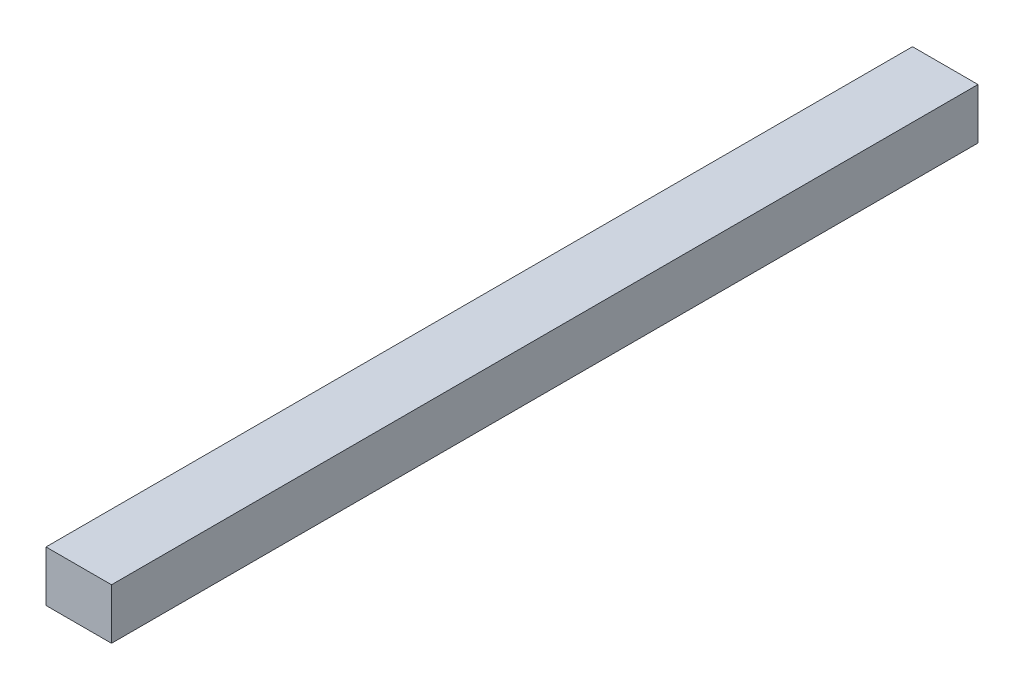
ISO-10303-21;
HEADER;
FILE_DESCRIPTION(('STEP AP214'),'2;1');
FILE_NAME('part.step','',(''),(''),'','','');
FILE_SCHEMA(('AUTOMOTIVE_DESIGN { 1 0 10303 214 1 1 1 1 }'));
ENDSEC;
DATA;
#1=APPLICATION_CONTEXT('core data for automotive mechanical design processes');
#2=APPLICATION_PROTOCOL_DEFINITION('international standard','automotive_design',2000,#1);
#3=PRODUCT_CONTEXT('',#1,'mechanical');
#4=PRODUCT('Part','Part','',(#3));
#5=PRODUCT_RELATED_PRODUCT_CATEGORY('part','',(#4));
#6=PRODUCT_DEFINITION_FORMATION('','',#4);
#7=PRODUCT_DEFINITION_CONTEXT('part definition',#1,'design');
#8=PRODUCT_DEFINITION('design','',#6,#7);
#9=PRODUCT_DEFINITION_SHAPE('','',#8);
#10=(LENGTH_UNIT() NAMED_UNIT(*) SI_UNIT(.MILLI.,.METRE.));
#11=(NAMED_UNIT(*) PLANE_ANGLE_UNIT() SI_UNIT($,.RADIAN.));
#12=(NAMED_UNIT(*) SI_UNIT($,.STERADIAN.) SOLID_ANGLE_UNIT());
#13=UNCERTAINTY_MEASURE_WITH_UNIT(LENGTH_MEASURE(1.E-05),#10,'distance_accuracy_value','');
#14=(GEOMETRIC_REPRESENTATION_CONTEXT(3) GLOBAL_UNCERTAINTY_ASSIGNED_CONTEXT((#13)) GLOBAL_UNIT_ASSIGNED_CONTEXT((#10,
#11,#12)) REPRESENTATION_CONTEXT('',''));
#15=CARTESIAN_POINT('',(0.,0.,0.));
#16=DIRECTION('',(0.,0.,1.));
#17=DIRECTION('',(1.,0.,0.));
#18=AXIS2_PLACEMENT_3D('',#15,#16,#17);
#19=CARTESIAN_POINT('',(1.55,-1.2,41.));
#20=DIRECTION('',(-1.,0.,0.));
#21=DIRECTION('',(0.,0.,1.));
#22=AXIS2_PLACEMENT_3D('',#19,#20,#21);
#23=PLANE('',#22);
#24=DIRECTION('',(0.,1.,0.));
#25=VECTOR('',#24,1.);
#26=CARTESIAN_POINT('',(1.55,-1.2,0.));
#27=LINE('',#26,#25);
#28=CARTESIAN_POINT('',(1.55,-1.2,0.));
#29=VERTEX_POINT('',#28);
#30=CARTESIAN_POINT('',(1.55,1.2,0.));
#31=VERTEX_POINT('',#30);
#32=EDGE_CURVE('E96',#29,#31,#27,.T.);
#33=ORIENTED_EDGE('',*,*,#32,.T.);
#34=DIRECTION('',(0.,0.,-1.));
#35=VECTOR('',#34,1.);
#36=CARTESIAN_POINT('',(1.55,1.2,41.));
#37=LINE('',#36,#35);
#38=CARTESIAN_POINT('',(1.55,1.2,41.));
#39=VERTEX_POINT('',#38);
#40=EDGE_CURVE('E11',#39,#31,#37,.T.);
#41=ORIENTED_EDGE('',*,*,#40,.F.);
#42=DIRECTION('',(0.,1.,0.));
#43=VECTOR('',#42,1.);
#44=CARTESIAN_POINT('',(1.55,-1.2,41.));
#45=LINE('',#44,#43);
#46=CARTESIAN_POINT('',(1.55,-1.2,41.));
#47=VERTEX_POINT('',#46);
#48=EDGE_CURVE('E84',#47,#39,#45,.T.);
#49=ORIENTED_EDGE('',*,*,#48,.F.);
#50=DIRECTION('',(0.,0.,-1.));
#51=VECTOR('',#50,1.);
#52=CARTESIAN_POINT('',(1.55,-1.2,41.));
#53=LINE('',#52,#51);
#54=EDGE_CURVE('E92',#47,#29,#53,.T.);
#55=ORIENTED_EDGE('',*,*,#54,.T.);
#56=EDGE_LOOP('',(#33,#41,#49,#55));
#57=FACE_BOUND('',#56,.T.);
#58=ADVANCED_FACE('F33',(#57),#23,.F.);
#59=CARTESIAN_POINT('',(-1.55,1.2,41.));
#60=DIRECTION('',(0.,-1.,0.));
#61=DIRECTION('',(0.,0.,-1.));
#62=AXIS2_PLACEMENT_3D('',#59,#60,#61);
#63=PLANE('',#62);
#64=DIRECTION('',(-1.,0.,0.));
#65=VECTOR('',#64,1.);
#66=CARTESIAN_POINT('',(-1.55,1.2,0.));
#67=LINE('',#66,#65);
#68=CARTESIAN_POINT('',(-1.55,1.2,0.));
#69=VERTEX_POINT('',#68);
#70=EDGE_CURVE('E88',#31,#69,#67,.T.);
#71=ORIENTED_EDGE('',*,*,#70,.T.);
#72=DIRECTION('',(0.,0.,-1.));
#73=VECTOR('',#72,1.);
#74=CARTESIAN_POINT('',(-1.55,1.2,41.));
#75=LINE('',#74,#73);
#76=CARTESIAN_POINT('',(-1.55,1.2,41.));
#77=VERTEX_POINT('',#76);
#78=EDGE_CURVE('E41',#77,#69,#75,.T.);
#79=ORIENTED_EDGE('',*,*,#78,.F.);
#80=DIRECTION('',(-1.,0.,0.));
#81=VECTOR('',#80,1.);
#82=CARTESIAN_POINT('',(-1.55,1.2,41.));
#83=LINE('',#82,#81);
#84=EDGE_CURVE('E79',#39,#77,#83,.T.);
#85=ORIENTED_EDGE('',*,*,#84,.F.);
#86=ORIENTED_EDGE('',*,*,#40,.T.);
#87=EDGE_LOOP('',(#71,#79,#85,#86));
#88=FACE_BOUND('',#87,.T.);
#89=ADVANCED_FACE('F87',(#88),#63,.F.);
#90=CARTESIAN_POINT('',(-1.55,-1.2,41.));
#91=DIRECTION('',(1.,0.,0.));
#92=DIRECTION('',(0.,0.,-1.));
#93=AXIS2_PLACEMENT_3D('',#90,#91,#92);
#94=PLANE('',#93);
#95=DIRECTION('',(0.,-1.,0.));
#96=VECTOR('',#95,1.);
#97=CARTESIAN_POINT('',(-1.55,-1.2,0.));
#98=LINE('',#97,#96);
#99=CARTESIAN_POINT('',(-1.55,-1.2,0.));
#100=VERTEX_POINT('',#99);
#101=EDGE_CURVE('E66',#69,#100,#98,.T.);
#102=ORIENTED_EDGE('',*,*,#101,.T.);
#103=DIRECTION('',(0.,0.,-1.));
#104=VECTOR('',#103,1.);
#105=CARTESIAN_POINT('',(-1.55,-1.2,41.));
#106=LINE('',#105,#104);
#107=CARTESIAN_POINT('',(-1.55,-1.2,41.));
#108=VERTEX_POINT('',#107);
#109=EDGE_CURVE('E89',#108,#100,#106,.T.);
#110=ORIENTED_EDGE('',*,*,#109,.F.);
#111=DIRECTION('',(0.,-1.,0.));
#112=VECTOR('',#111,1.);
#113=CARTESIAN_POINT('',(-1.55,-1.2,41.));
#114=LINE('',#113,#112);
#115=EDGE_CURVE('E82',#77,#108,#114,.T.);
#116=ORIENTED_EDGE('',*,*,#115,.F.);
#117=ORIENTED_EDGE('',*,*,#78,.T.);
#118=EDGE_LOOP('',(#102,#110,#116,#117));
#119=FACE_BOUND('',#118,.T.);
#120=ADVANCED_FACE('F90',(#119),#94,.F.);
#121=CARTESIAN_POINT('',(-1.55,-1.2,41.));
#122=DIRECTION('',(0.,1.,0.));
#123=DIRECTION('',(0.,0.,1.));
#124=AXIS2_PLACEMENT_3D('',#121,#122,#123);
#125=PLANE('',#124);
#126=DIRECTION('',(1.,0.,0.));
#127=VECTOR('',#126,1.);
#128=CARTESIAN_POINT('',(-1.55,-1.2,0.));
#129=LINE('',#128,#127);
#130=EDGE_CURVE('E72',#100,#29,#129,.T.);
#131=ORIENTED_EDGE('',*,*,#130,.T.);
#132=ORIENTED_EDGE('',*,*,#54,.F.);
#133=DIRECTION('',(1.,0.,0.));
#134=VECTOR('',#133,1.);
#135=CARTESIAN_POINT('',(-1.55,-1.2,41.));
#136=LINE('',#135,#134);
#137=EDGE_CURVE('E49',#108,#47,#136,.T.);
#138=ORIENTED_EDGE('',*,*,#137,.F.);
#139=ORIENTED_EDGE('',*,*,#109,.T.);
#140=EDGE_LOOP('',(#131,#132,#138,#139));
#141=FACE_BOUND('',#140,.T.);
#142=ADVANCED_FACE('F103',(#141),#125,.F.);
#143=CARTESIAN_POINT('',(0.,0.,41.));
#144=DIRECTION('',(0.,0.,-1.));
#145=DIRECTION('',(-1.,0.,0.));
#146=AXIS2_PLACEMENT_3D('',#143,#144,#145);
#147=PLANE('',#146);
#148=ORIENTED_EDGE('',*,*,#48,.T.);
#149=ORIENTED_EDGE('',*,*,#84,.T.);
#150=ORIENTED_EDGE('',*,*,#115,.T.);
#151=ORIENTED_EDGE('',*,*,#137,.T.);
#152=EDGE_LOOP('',(#148,#149,#150,#151));
#153=FACE_BOUND('',#152,.T.);
#154=ADVANCED_FACE('F80',(#153),#147,.F.);
#155=CARTESIAN_POINT('',(0.,0.,0.));
#156=DIRECTION('',(0.,0.,-1.));
#157=DIRECTION('',(-1.,0.,0.));
#158=AXIS2_PLACEMENT_3D('',#155,#156,#157);
#159=PLANE('',#158);
#160=ORIENTED_EDGE('',*,*,#32,.F.);
#161=ORIENTED_EDGE('',*,*,#130,.F.);
#162=ORIENTED_EDGE('',*,*,#101,.F.);
#163=ORIENTED_EDGE('',*,*,#70,.F.);
#164=EDGE_LOOP('',(#160,#161,#162,#163));
#165=FACE_BOUND('',#164,.T.);
#166=ADVANCED_FACE('F106',(#165),#159,.T.);
#167=CLOSED_SHELL('',(#58,#89,#120,#142,#154,#166));
#168=MANIFOLD_SOLID_BREP('B2',#167);
#169=ADVANCED_BREP_SHAPE_REPRESENTATION('',(#18,#168),#14);
#170=SHAPE_DEFINITION_REPRESENTATION(#9,#169);
ENDSEC;
END-ISO-10303-21;
